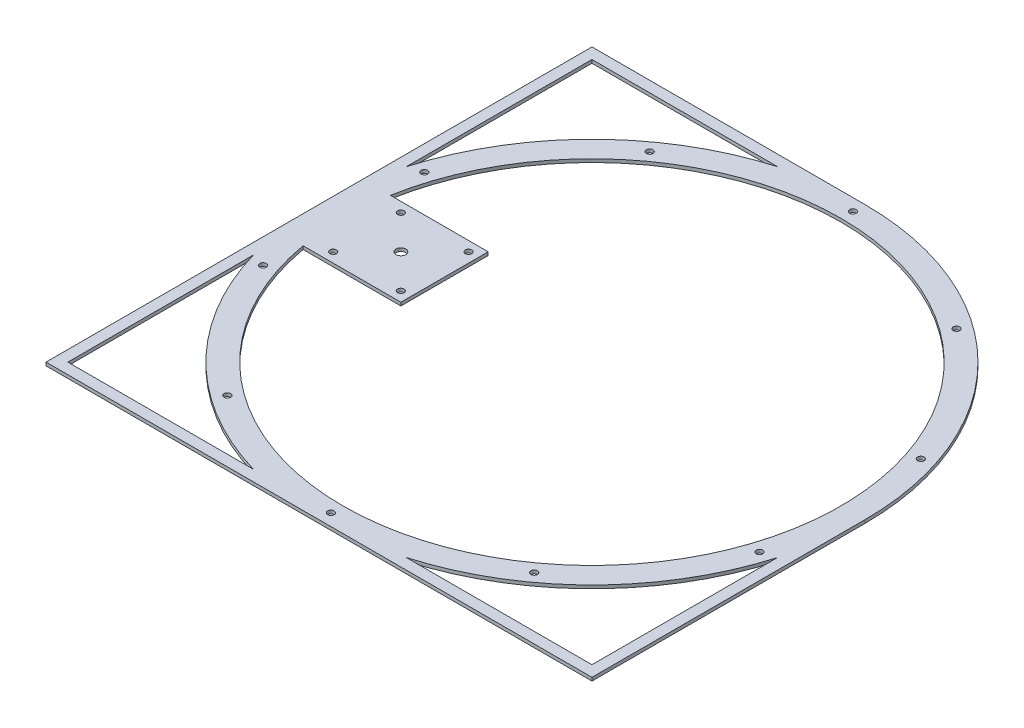
ISO-10303-21;
HEADER;
FILE_DESCRIPTION(('STEP AP214'),'2;1');
FILE_NAME('part.step','',(''),(''),'','','');
FILE_SCHEMA(('AUTOMOTIVE_DESIGN { 1 0 10303 214 1 1 1 1 }'));
ENDSEC;
DATA;
#1=APPLICATION_CONTEXT('core data for automotive mechanical design processes');
#2=APPLICATION_PROTOCOL_DEFINITION('international standard','automotive_design',2000,#1);
#3=PRODUCT_CONTEXT('',#1,'mechanical');
#4=PRODUCT('Part','Part','',(#3));
#5=PRODUCT_RELATED_PRODUCT_CATEGORY('part','',(#4));
#6=PRODUCT_DEFINITION_FORMATION('','',#4);
#7=PRODUCT_DEFINITION_CONTEXT('part definition',#1,'design');
#8=PRODUCT_DEFINITION('design','',#6,#7);
#9=PRODUCT_DEFINITION_SHAPE('','',#8);
#10=(LENGTH_UNIT() NAMED_UNIT(*) SI_UNIT(.MILLI.,.METRE.));
#11=(NAMED_UNIT(*) PLANE_ANGLE_UNIT() SI_UNIT($,.RADIAN.));
#12=(NAMED_UNIT(*) SI_UNIT($,.STERADIAN.) SOLID_ANGLE_UNIT());
#13=UNCERTAINTY_MEASURE_WITH_UNIT(LENGTH_MEASURE(1.E-05),#10,'distance_accuracy_value','');
#14=(GEOMETRIC_REPRESENTATION_CONTEXT(3) GLOBAL_UNCERTAINTY_ASSIGNED_CONTEXT((#13)) GLOBAL_UNIT_ASSIGNED_CONTEXT((#10,
#11,#12)) REPRESENTATION_CONTEXT('',''));
#15=CARTESIAN_POINT('',(0.,0.,0.));
#16=DIRECTION('',(0.,0.,1.));
#17=DIRECTION('',(1.,0.,0.));
#18=AXIS2_PLACEMENT_3D('',#15,#16,#17);
#19=CARTESIAN_POINT('',(0.,1.5,0.));
#20=DIRECTION('',(0.,1.,0.));
#21=DIRECTION('',(0.,0.,1.));
#22=AXIS2_PLACEMENT_3D('',#19,#20,#21);
#23=PLANE('',#22);
#24=CARTESIAN_POINT('',(-125.,1.5,125.));
#25=DIRECTION('',(0.,1.,0.));
#26=DIRECTION('',(0.,0.,1.));
#27=AXIS2_PLACEMENT_3D('',#24,#25,#26);
#28=CIRCLE('',#27,125.);
#29=CARTESIAN_POINT('',(0.,1.5,125.));
#30=VERTEX_POINT('',#29);
#31=CARTESIAN_POINT('',(-125.,1.5,0.));
#32=VERTEX_POINT('',#31);
#33=EDGE_CURVE('E254',#30,#32,#28,.T.);
#34=ORIENTED_EDGE('',*,*,#33,.T.);
#35=DIRECTION('',(-1.,0.,0.));
#36=VECTOR('',#35,1.);
#37=CARTESIAN_POINT('',(0.,1.5,0.));
#38=LINE('',#37,#36);
#39=CARTESIAN_POINT('',(-250.,1.5,0.));
#40=VERTEX_POINT('',#39);
#41=EDGE_CURVE('E258',#32,#40,#38,.T.);
#42=ORIENTED_EDGE('',*,*,#41,.T.);
#43=DIRECTION('',(0.,0.,1.));
#44=VECTOR('',#43,1.);
#45=CARTESIAN_POINT('',(-250.,1.5,0.));
#46=LINE('',#45,#44);
#47=CARTESIAN_POINT('',(-250.,1.5,250.));
#48=VERTEX_POINT('',#47);
#49=EDGE_CURVE('E383',#40,#48,#46,.T.);
#50=ORIENTED_EDGE('',*,*,#49,.T.);
#51=DIRECTION('',(-1.,0.,0.));
#52=VECTOR('',#51,1.);
#53=CARTESIAN_POINT('',(0.,1.5,250.));
#54=LINE('',#53,#52);
#55=CARTESIAN_POINT('',(0.,1.5,250.));
#56=VERTEX_POINT('',#55);
#57=EDGE_CURVE('E289',#56,#48,#54,.T.);
#58=ORIENTED_EDGE('',*,*,#57,.F.);
#59=DIRECTION('',(0.,0.,1.));
#60=VECTOR('',#59,1.);
#61=CARTESIAN_POINT('',(0.,1.5,0.));
#62=LINE('',#61,#60);
#63=EDGE_CURVE('E261',#30,#56,#62,.T.);
#64=ORIENTED_EDGE('',*,*,#63,.F.);
#65=EDGE_LOOP('',(#34,#42,#50,#58,#64));
#66=FACE_BOUND('',#65,.T.);
#67=CARTESIAN_POINT('',(-125.,1.5,125.));
#68=DIRECTION('',(0.,1.,0.));
#69=DIRECTION('',(0.,0.,1.));
#70=AXIS2_PLACEMENT_3D('',#67,#68,#69);
#71=CIRCLE('',#70,114.05);
#72=CARTESIAN_POINT('',(-237.2826901174,1.5,145.));
#73=VERTEX_POINT('',#72);
#74=CARTESIAN_POINT('',(-237.2826901174,1.5,105.));
#75=VERTEX_POINT('',#74);
#76=EDGE_CURVE('E552',#73,#75,#71,.T.);
#77=ORIENTED_EDGE('',*,*,#76,.F.);
#78=DIRECTION('',(1.,0.,0.));
#79=VECTOR('',#78,1.);
#80=CARTESIAN_POINT('',(-1.00613961606655E-13,1.5,145.));
#81=LINE('',#80,#79);
#82=CARTESIAN_POINT('',(-192.5,1.5,145.));
#83=VERTEX_POINT('',#82);
#84=EDGE_CURVE('E565',#73,#83,#81,.T.);
#85=ORIENTED_EDGE('',*,*,#84,.T.);
#86=DIRECTION('',(0.,0.,-1.));
#87=VECTOR('',#86,1.);
#88=CARTESIAN_POINT('',(-192.5,1.5,0.));
#89=LINE('',#88,#87);
#90=CARTESIAN_POINT('',(-192.5,1.5,105.));
#91=VERTEX_POINT('',#90);
#92=EDGE_CURVE('E561',#83,#91,#89,.T.);
#93=ORIENTED_EDGE('',*,*,#92,.T.);
#94=DIRECTION('',(-1.,0.,0.));
#95=VECTOR('',#94,1.);
#96=CARTESIAN_POINT('',(0.,1.5,105.));
#97=LINE('',#96,#95);
#98=EDGE_CURVE('E555',#91,#75,#97,.T.);
#99=ORIENTED_EDGE('',*,*,#98,.T.);
#100=EDGE_LOOP('',(#77,#85,#93,#99));
#101=FACE_BOUND('',#100,.T.);
#102=CARTESIAN_POINT('',(-197.,1.5,140.5));
#103=DIRECTION('',(0.,1.,0.));
#104=DIRECTION('',(0.,0.,1.));
#105=AXIS2_PLACEMENT_3D('',#102,#103,#104);
#106=CIRCLE('',#105,1.5);
#107=CARTESIAN_POINT('',(-197.,1.5,142.));
#108=VERTEX_POINT('',#107);
#109=EDGE_CURVE('E512',#108,#108,#106,.T.);
#110=ORIENTED_EDGE('',*,*,#109,.F.);
#111=EDGE_LOOP('',(#110));
#112=FACE_BOUND('',#111,.T.);
#113=CARTESIAN_POINT('',(-197.,1.5,109.5));
#114=DIRECTION('',(0.,1.,0.));
#115=DIRECTION('',(0.,0.,1.));
#116=AXIS2_PLACEMENT_3D('',#113,#114,#115);
#117=CIRCLE('',#116,1.5);
#118=CARTESIAN_POINT('',(-197.,1.5,111.));
#119=VERTEX_POINT('',#118);
#120=EDGE_CURVE('E527',#119,#119,#117,.T.);
#121=ORIENTED_EDGE('',*,*,#120,.F.);
#122=EDGE_LOOP('',(#121));
#123=FACE_BOUND('',#122,.T.);
#124=CARTESIAN_POINT('',(-228.,1.5,109.5));
#125=DIRECTION('',(0.,1.,0.));
#126=DIRECTION('',(0.,0.,1.));
#127=AXIS2_PLACEMENT_3D('',#124,#125,#126);
#128=CIRCLE('',#127,1.50000000000003);
#129=CARTESIAN_POINT('',(-228.,1.5,111.));
#130=VERTEX_POINT('',#129);
#131=EDGE_CURVE('E523',#130,#130,#128,.T.);
#132=ORIENTED_EDGE('',*,*,#131,.F.);
#133=EDGE_LOOP('',(#132));
#134=FACE_BOUND('',#133,.T.);
#135=CARTESIAN_POINT('',(-228.,1.5,140.5));
#136=DIRECTION('',(0.,1.,0.));
#137=DIRECTION('',(0.,0.,1.));
#138=AXIS2_PLACEMENT_3D('',#135,#136,#137);
#139=CIRCLE('',#138,1.49999999999997);
#140=CARTESIAN_POINT('',(-228.,1.5,142.));
#141=VERTEX_POINT('',#140);
#142=EDGE_CURVE('E519',#141,#141,#139,.T.);
#143=ORIENTED_EDGE('',*,*,#142,.F.);
#144=EDGE_LOOP('',(#143));
#145=FACE_BOUND('',#144,.T.);
#146=CARTESIAN_POINT('',(-212.5,1.5,125.));
#147=DIRECTION('',(0.,1.,0.));
#148=DIRECTION('',(0.,0.,1.));
#149=AXIS2_PLACEMENT_3D('',#146,#147,#148);
#150=CIRCLE('',#149,2.25000000000001);
#151=CARTESIAN_POINT('',(-212.5,1.5,127.25));
#152=VERTEX_POINT('',#151);
#153=EDGE_CURVE('E399',#152,#152,#150,.T.);
#154=ORIENTED_EDGE('',*,*,#153,.F.);
#155=EDGE_LOOP('',(#154));
#156=FACE_BOUND('',#155,.T.);
#157=CARTESIAN_POINT('',(-125.,1.5,5.475));
#158=DIRECTION('',(0.,1.,0.));
#159=DIRECTION('',(0.,0.,1.));
#160=AXIS2_PLACEMENT_3D('',#157,#158,#159);
#161=CIRCLE('',#160,1.5);
#162=CARTESIAN_POINT('',(-125.,1.5,6.975));
#163=VERTEX_POINT('',#162);
#164=EDGE_CURVE('E282',#163,#163,#161,.T.);
#165=ORIENTED_EDGE('',*,*,#164,.F.);
#166=EDGE_LOOP('',(#165));
#167=FACE_BOUND('',#166,.T.);
#168=CARTESIAN_POINT('',(-195.255032280254,1.5,28.3022437473405));
#169=DIRECTION('',(0.,1.,0.));
#170=DIRECTION('',(0.,0.,1.));
#171=AXIS2_PLACEMENT_3D('',#168,#169,#170);
#172=CIRCLE('',#171,1.5);
#173=CARTESIAN_POINT('',(-195.255032280254,1.5,29.8022437473405));
#174=VERTEX_POINT('',#173);
#175=EDGE_CURVE('E287',#174,#174,#172,.T.);
#176=ORIENTED_EDGE('',*,*,#175,.F.);
#177=EDGE_LOOP('',(#176));
#178=FACE_BOUND('',#177,.T.);
#179=CARTESIAN_POINT('',(-238.675030110163,1.5,161.935256252676));
#180=DIRECTION('',(0.,1.,0.));
#181=DIRECTION('',(0.,0.,1.));
#182=AXIS2_PLACEMENT_3D('',#179,#180,#181);
#183=CIRCLE('',#182,1.49999999999998);
#184=CARTESIAN_POINT('',(-238.675030110163,1.5,163.435256252676));
#185=VERTEX_POINT('',#184);
#186=EDGE_CURVE('E296',#185,#185,#183,.T.);
#187=ORIENTED_EDGE('',*,*,#186,.F.);
#188=EDGE_LOOP('',(#187));
#189=FACE_BOUND('',#188,.T.);
#190=CARTESIAN_POINT('',(-124.999999999977,1.5,244.525));
#191=DIRECTION('',(0.,1.,0.));
#192=DIRECTION('',(0.,0.,1.));
#193=AXIS2_PLACEMENT_3D('',#190,#191,#192);
#194=CIRCLE('',#193,1.49999999999996);
#195=CARTESIAN_POINT('',(-124.999999999977,1.5,246.025));
#196=VERTEX_POINT('',#195);
#197=EDGE_CURVE('E300',#196,#196,#194,.T.);
#198=ORIENTED_EDGE('',*,*,#197,.F.);
#199=EDGE_LOOP('',(#198));
#200=FACE_BOUND('',#199,.T.);
#201=CARTESIAN_POINT('',(-11.3249698898063,1.5,161.935256252655));
#202=DIRECTION('',(0.,1.,0.));
#203=DIRECTION('',(0.,0.,1.));
#204=AXIS2_PLACEMENT_3D('',#201,#202,#203);
#205=CIRCLE('',#204,1.5);
#206=CARTESIAN_POINT('',(-11.3249698898063,1.5,163.435256252655));
#207=VERTEX_POINT('',#206);
#208=EDGE_CURVE('E304',#207,#207,#205,.T.);
#209=ORIENTED_EDGE('',*,*,#208,.F.);
#210=EDGE_LOOP('',(#209));
#211=FACE_BOUND('',#210,.T.);
#212=CARTESIAN_POINT('',(-54.7449677197397,1.5,28.3022437473275));
#213=DIRECTION('',(0.,1.,0.));
#214=DIRECTION('',(0.,0.,1.));
#215=AXIS2_PLACEMENT_3D('',#212,#213,#214);
#216=CIRCLE('',#215,1.50000000000001);
#217=CARTESIAN_POINT('',(-54.7449677197397,1.5,29.8022437473275));
#218=VERTEX_POINT('',#217);
#219=EDGE_CURVE('E308',#218,#218,#216,.T.);
#220=ORIENTED_EDGE('',*,*,#219,.F.);
#221=EDGE_LOOP('',(#220));
#222=FACE_BOUND('',#221,.T.);
#223=CARTESIAN_POINT('',(-238.675030110175,1.5,88.0647437473363));
#224=DIRECTION('',(0.,1.,0.));
#225=DIRECTION('',(0.,0.,1.));
#226=AXIS2_PLACEMENT_3D('',#223,#224,#225);
#227=CIRCLE('',#226,1.49999999999999);
#228=CARTESIAN_POINT('',(-238.675030110175,1.5,89.5647437473363));
#229=VERTEX_POINT('',#228);
#230=EDGE_CURVE('E312',#229,#229,#227,.T.);
#231=ORIENTED_EDGE('',*,*,#230,.F.);
#232=EDGE_LOOP('',(#231));
#233=FACE_BOUND('',#232,.T.);
#234=CARTESIAN_POINT('',(-195.255032280253,1.5,221.697756252667));
#235=DIRECTION('',(0.,1.,0.));
#236=DIRECTION('',(0.,0.,1.));
#237=AXIS2_PLACEMENT_3D('',#234,#235,#236);
#238=CIRCLE('',#237,1.50000000000002);
#239=CARTESIAN_POINT('',(-195.255032280253,1.5,223.197756252667));
#240=VERTEX_POINT('',#239);
#241=EDGE_CURVE('E316',#240,#240,#238,.T.);
#242=ORIENTED_EDGE('',*,*,#241,.F.);
#243=EDGE_LOOP('',(#242));
#244=FACE_BOUND('',#243,.T.);
#245=CARTESIAN_POINT('',(-54.7449677197365,1.5,221.697756252664));
#246=DIRECTION('',(0.,1.,0.));
#247=DIRECTION('',(0.,0.,1.));
#248=AXIS2_PLACEMENT_3D('',#245,#246,#247);
#249=CIRCLE('',#248,1.5);
#250=CARTESIAN_POINT('',(-54.7449677197365,1.5,223.197756252664));
#251=VERTEX_POINT('',#250);
#252=EDGE_CURVE('E320',#251,#251,#249,.T.);
#253=ORIENTED_EDGE('',*,*,#252,.F.);
#254=EDGE_LOOP('',(#253));
#255=FACE_BOUND('',#254,.T.);
#256=CARTESIAN_POINT('',(-11.3249698898193,1.5,88.0647437473315));
#257=DIRECTION('',(0.,1.,0.));
#258=DIRECTION('',(0.,0.,1.));
#259=AXIS2_PLACEMENT_3D('',#256,#257,#258);
#260=CIRCLE('',#259,1.50000000000001);
#261=CARTESIAN_POINT('',(-11.3249698898193,1.5,89.5647437473315));
#262=VERTEX_POINT('',#261);
#263=EDGE_CURVE('E324',#262,#262,#260,.T.);
#264=ORIENTED_EDGE('',*,*,#263,.F.);
#265=EDGE_LOOP('',(#264));
#266=FACE_BOUND('',#265,.T.);
#267=DIRECTION('',(1.,0.,0.));
#268=VECTOR('',#267,1.);
#269=CARTESIAN_POINT('',(0.,1.5,4.99999999999777));
#270=LINE('',#269,#268);
#271=CARTESIAN_POINT('',(-245.,1.5,5.));
#272=VERTEX_POINT('',#271);
#273=CARTESIAN_POINT('',(-159.999999999997,1.5,4.99999999999923));
#274=VERTEX_POINT('',#273);
#275=EDGE_CURVE('E473',#272,#274,#270,.T.);
#276=ORIENTED_EDGE('',*,*,#275,.T.);
#277=CARTESIAN_POINT('',(-125.,1.5,125.));
#278=DIRECTION('',(0.,1.,0.));
#279=DIRECTION('',(0.,0.,1.));
#280=AXIS2_PLACEMENT_3D('',#277,#278,#279);
#281=CIRCLE('',#280,125.);
#282=CARTESIAN_POINT('',(-245.000000000001,1.5,90.0000000000029));
#283=VERTEX_POINT('',#282);
#284=EDGE_CURVE('E468',#274,#283,#281,.T.);
#285=ORIENTED_EDGE('',*,*,#284,.T.);
#286=DIRECTION('',(0.,0.,1.));
#287=VECTOR('',#286,1.);
#288=CARTESIAN_POINT('',(-245.,1.5,-2.16003685526328E-12));
#289=LINE('',#288,#287);
#290=EDGE_CURVE('E504',#272,#283,#289,.T.);
#291=ORIENTED_EDGE('',*,*,#290,.F.);
#292=EDGE_LOOP('',(#276,#285,#291));
#293=FACE_BOUND('',#292,.T.);
#294=DIRECTION('',(-1.,0.,0.));
#295=VECTOR('',#294,1.);
#296=CARTESIAN_POINT('',(1.60002730019502E-13,1.5,245.000000000001));
#297=LINE('',#296,#295);
#298=CARTESIAN_POINT('',(-4.9999999999992,1.5,245.000000000001));
#299=VERTEX_POINT('',#298);
#300=CARTESIAN_POINT('',(-90.0000000000027,1.5,245.000000000001));
#301=VERTEX_POINT('',#300);
#302=EDGE_CURVE('E484',#299,#301,#297,.T.);
#303=ORIENTED_EDGE('',*,*,#302,.T.);
#304=CARTESIAN_POINT('',(-125.,1.5,125.));
#305=DIRECTION('',(0.,1.,0.));
#306=DIRECTION('',(0.,0.,1.));
#307=AXIS2_PLACEMENT_3D('',#304,#305,#306);
#308=CIRCLE('',#307,125.);
#309=CARTESIAN_POINT('',(-4.99999999999914,1.5,159.999999999997));
#310=VERTEX_POINT('',#309);
#311=EDGE_CURVE('E152',#301,#310,#308,.T.);
#312=ORIENTED_EDGE('',*,*,#311,.T.);
#313=DIRECTION('',(0.,0.,-1.));
#314=VECTOR('',#313,1.);
#315=CARTESIAN_POINT('',(-4.99999999999904,1.5,0.));
#316=LINE('',#315,#314);
#317=EDGE_CURVE('E488',#299,#310,#316,.T.);
#318=ORIENTED_EDGE('',*,*,#317,.F.);
#319=EDGE_LOOP('',(#303,#312,#318));
#320=FACE_BOUND('',#319,.T.);
#321=DIRECTION('',(0.,0.,-1.));
#322=VECTOR('',#321,1.);
#323=CARTESIAN_POINT('',(-244.999999999993,1.5,-7.44012694590663E-12));
#324=LINE('',#323,#322);
#325=CARTESIAN_POINT('',(-245.000000000001,1.5,245.000000000001));
#326=VERTEX_POINT('',#325);
#327=CARTESIAN_POINT('',(-244.999999999998,1.5,159.999999999998));
#328=VERTEX_POINT('',#327);
#329=EDGE_CURVE('E582',#326,#328,#324,.T.);
#330=ORIENTED_EDGE('',*,*,#329,.T.);
#331=CARTESIAN_POINT('',(-125.,1.5,125.));
#332=DIRECTION('',(0.,1.,0.));
#333=DIRECTION('',(0.,0.,1.));
#334=AXIS2_PLACEMENT_3D('',#331,#332,#333);
#335=CIRCLE('',#334,125.);
#336=CARTESIAN_POINT('',(-159.999999999997,1.5,245.000000000001));
#337=VERTEX_POINT('',#336);
#338=EDGE_CURVE('E144',#328,#337,#335,.T.);
#339=ORIENTED_EDGE('',*,*,#338,.T.);
#340=DIRECTION('',(1.,0.,0.));
#341=VECTOR('',#340,1.);
#342=CARTESIAN_POINT('',(0.,1.5,245.000000000001));
#343=LINE('',#342,#341);
#344=EDGE_CURVE('E466',#326,#337,#343,.T.);
#345=ORIENTED_EDGE('',*,*,#344,.F.);
#346=EDGE_LOOP('',(#330,#339,#345));
#347=FACE_BOUND('',#346,.T.);
#348=ADVANCED_FACE('F128',(#66,#101,#112,#123,#134,#145,#156,#167,#178,#189,#200,#211,#222,#233,
#244,#255,#266,#293,#320,#347),#23,.T.);
#349=CARTESIAN_POINT('',(0.,0.,0.));
#350=DIRECTION('',(0.,1.,0.));
#351=DIRECTION('',(0.,0.,1.));
#352=AXIS2_PLACEMENT_3D('',#349,#350,#351);
#353=PLANE('',#352);
#354=CARTESIAN_POINT('',(-125.,0.,125.));
#355=DIRECTION('',(0.,1.,0.));
#356=DIRECTION('',(0.,0.,1.));
#357=AXIS2_PLACEMENT_3D('',#354,#355,#356);
#358=CIRCLE('',#357,125.);
#359=CARTESIAN_POINT('',(-90.0000000000027,0.,245.000000000001));
#360=VERTEX_POINT('',#359);
#361=CARTESIAN_POINT('',(-4.99999999999914,0.,159.999999999997));
#362=VERTEX_POINT('',#361);
#363=EDGE_CURVE('E446',#360,#362,#358,.T.);
#364=ORIENTED_EDGE('',*,*,#363,.F.);
#365=DIRECTION('',(-1.,0.,0.));
#366=VECTOR('',#365,1.);
#367=CARTESIAN_POINT('',(1.60002730019502E-13,0.,245.000000000001));
#368=LINE('',#367,#366);
#369=CARTESIAN_POINT('',(-4.9999999999992,0.,245.000000000001));
#370=VERTEX_POINT('',#369);
#371=EDGE_CURVE('E439',#370,#360,#368,.T.);
#372=ORIENTED_EDGE('',*,*,#371,.F.);
#373=DIRECTION('',(0.,0.,-1.));
#374=VECTOR('',#373,1.);
#375=CARTESIAN_POINT('',(-4.99999999999904,0.,0.));
#376=LINE('',#375,#374);
#377=EDGE_CURVE('E442',#370,#362,#376,.T.);
#378=ORIENTED_EDGE('',*,*,#377,.T.);
#379=EDGE_LOOP('',(#364,#372,#378));
#380=FACE_BOUND('',#379,.T.);
#381=DIRECTION('',(1.,0.,0.));
#382=VECTOR('',#381,1.);
#383=CARTESIAN_POINT('',(-1.00613961606655E-13,0.,145.));
#384=LINE('',#383,#382);
#385=CARTESIAN_POINT('',(-237.2826901174,0.,145.));
#386=VERTEX_POINT('',#385);
#387=CARTESIAN_POINT('',(-192.5,0.,145.));
#388=VERTEX_POINT('',#387);
#389=EDGE_CURVE('E432',#386,#388,#384,.T.);
#390=ORIENTED_EDGE('',*,*,#389,.F.);
#391=CARTESIAN_POINT('',(-125.,0.,125.));
#392=DIRECTION('',(0.,1.,0.));
#393=DIRECTION('',(0.,0.,1.));
#394=AXIS2_PLACEMENT_3D('',#391,#392,#393);
#395=CIRCLE('',#394,114.05);
#396=CARTESIAN_POINT('',(-237.2826901174,0.,105.));
#397=VERTEX_POINT('',#396);
#398=EDGE_CURVE('E435',#386,#397,#395,.T.);
#399=ORIENTED_EDGE('',*,*,#398,.T.);
#400=DIRECTION('',(-1.,0.,0.));
#401=VECTOR('',#400,1.);
#402=CARTESIAN_POINT('',(0.,0.,105.));
#403=LINE('',#402,#401);
#404=CARTESIAN_POINT('',(-192.5,0.,105.));
#405=VERTEX_POINT('',#404);
#406=EDGE_CURVE('E425',#405,#397,#403,.T.);
#407=ORIENTED_EDGE('',*,*,#406,.F.);
#408=DIRECTION('',(0.,0.,-1.));
#409=VECTOR('',#408,1.);
#410=CARTESIAN_POINT('',(-192.5,0.,0.));
#411=LINE('',#410,#409);
#412=EDGE_CURVE('E428',#388,#405,#411,.T.);
#413=ORIENTED_EDGE('',*,*,#412,.F.);
#414=EDGE_LOOP('',(#390,#399,#407,#413));
#415=FACE_BOUND('',#414,.T.);
#416=CARTESIAN_POINT('',(-125.,0.,125.));
#417=DIRECTION('',(0.,1.,0.));
#418=DIRECTION('',(0.,0.,1.));
#419=AXIS2_PLACEMENT_3D('',#416,#417,#418);
#420=CIRCLE('',#419,125.);
#421=CARTESIAN_POINT('',(-159.999999999997,0.,4.99999999999923));
#422=VERTEX_POINT('',#421);
#423=CARTESIAN_POINT('',(-245.000000000001,0.,90.0000000000029));
#424=VERTEX_POINT('',#423);
#425=EDGE_CURVE('E420',#422,#424,#420,.T.);
#426=ORIENTED_EDGE('',*,*,#425,.F.);
#427=DIRECTION('',(1.,0.,0.));
#428=VECTOR('',#427,1.);
#429=CARTESIAN_POINT('',(0.,0.,4.99999999999777));
#430=LINE('',#429,#428);
#431=CARTESIAN_POINT('',(-245.,0.,5.));
#432=VERTEX_POINT('',#431);
#433=EDGE_CURVE('E393',#432,#422,#430,.T.);
#434=ORIENTED_EDGE('',*,*,#433,.F.);
#435=DIRECTION('',(0.,0.,1.));
#436=VECTOR('',#435,1.);
#437=CARTESIAN_POINT('',(-245.,0.,-2.16003685526328E-12));
#438=LINE('',#437,#436);
#439=EDGE_CURVE('E416',#432,#424,#438,.T.);
#440=ORIENTED_EDGE('',*,*,#439,.T.);
#441=EDGE_LOOP('',(#426,#434,#440));
#442=FACE_BOUND('',#441,.T.);
#443=CARTESIAN_POINT('',(-197.,0.,140.5));
#444=DIRECTION('',(0.,1.,0.));
#445=DIRECTION('',(0.,0.,1.));
#446=AXIS2_PLACEMENT_3D('',#443,#444,#445);
#447=CIRCLE('',#446,1.5);
#448=CARTESIAN_POINT('',(-197.,0.,142.));
#449=VERTEX_POINT('',#448);
#450=EDGE_CURVE('E333',#449,#449,#447,.T.);
#451=ORIENTED_EDGE('',*,*,#450,.T.);
#452=EDGE_LOOP('',(#451));
#453=FACE_BOUND('',#452,.T.);
#454=CARTESIAN_POINT('',(-197.,0.,109.5));
#455=DIRECTION('',(0.,1.,0.));
#456=DIRECTION('',(0.,0.,1.));
#457=AXIS2_PLACEMENT_3D('',#454,#455,#456);
#458=CIRCLE('',#457,1.5);
#459=CARTESIAN_POINT('',(-197.,0.,111.));
#460=VERTEX_POINT('',#459);
#461=EDGE_CURVE('E407',#460,#460,#458,.T.);
#462=ORIENTED_EDGE('',*,*,#461,.T.);
#463=EDGE_LOOP('',(#462));
#464=FACE_BOUND('',#463,.T.);
#465=CARTESIAN_POINT('',(-228.,0.,109.5));
#466=DIRECTION('',(0.,1.,0.));
#467=DIRECTION('',(0.,0.,1.));
#468=AXIS2_PLACEMENT_3D('',#465,#466,#467);
#469=CIRCLE('',#468,1.50000000000003);
#470=CARTESIAN_POINT('',(-228.,0.,111.));
#471=VERTEX_POINT('',#470);
#472=EDGE_CURVE('E403',#471,#471,#469,.T.);
#473=ORIENTED_EDGE('',*,*,#472,.T.);
#474=EDGE_LOOP('',(#473));
#475=FACE_BOUND('',#474,.T.);
#476=CARTESIAN_POINT('',(-228.,0.,140.5));
#477=DIRECTION('',(0.,1.,0.));
#478=DIRECTION('',(0.,0.,1.));
#479=AXIS2_PLACEMENT_3D('',#476,#477,#478);
#480=CIRCLE('',#479,1.49999999999997);
#481=CARTESIAN_POINT('',(-228.,0.,142.));
#482=VERTEX_POINT('',#481);
#483=EDGE_CURVE('E398',#482,#482,#480,.T.);
#484=ORIENTED_EDGE('',*,*,#483,.T.);
#485=EDGE_LOOP('',(#484));
#486=FACE_BOUND('',#485,.T.);
#487=CARTESIAN_POINT('',(-212.5,0.,125.));
#488=DIRECTION('',(0.,1.,0.));
#489=DIRECTION('',(0.,0.,1.));
#490=AXIS2_PLACEMENT_3D('',#487,#488,#489);
#491=CIRCLE('',#490,2.25000000000001);
#492=CARTESIAN_POINT('',(-212.5,0.,127.25));
#493=VERTEX_POINT('',#492);
#494=EDGE_CURVE('E394',#493,#493,#491,.T.);
#495=ORIENTED_EDGE('',*,*,#494,.T.);
#496=EDGE_LOOP('',(#495));
#497=FACE_BOUND('',#496,.T.);
#498=CARTESIAN_POINT('',(-125.,0.,5.475));
#499=DIRECTION('',(0.,1.,0.));
#500=DIRECTION('',(0.,0.,1.));
#501=AXIS2_PLACEMENT_3D('',#498,#499,#500);
#502=CIRCLE('',#501,1.5);
#503=CARTESIAN_POINT('',(-125.,0.,6.975));
#504=VERTEX_POINT('',#503);
#505=EDGE_CURVE('E343',#504,#504,#502,.T.);
#506=ORIENTED_EDGE('',*,*,#505,.T.);
#507=EDGE_LOOP('',(#506));
#508=FACE_BOUND('',#507,.T.);
#509=CARTESIAN_POINT('',(-195.255032280254,0.,28.3022437473405));
#510=DIRECTION('',(0.,1.,0.));
#511=DIRECTION('',(0.,0.,1.));
#512=AXIS2_PLACEMENT_3D('',#509,#510,#511);
#513=CIRCLE('',#512,1.5);
#514=CARTESIAN_POINT('',(-195.255032280254,0.,29.8022437473405));
#515=VERTEX_POINT('',#514);
#516=EDGE_CURVE('E347',#515,#515,#513,.T.);
#517=ORIENTED_EDGE('',*,*,#516,.T.);
#518=EDGE_LOOP('',(#517));
#519=FACE_BOUND('',#518,.T.);
#520=CARTESIAN_POINT('',(-238.675030110163,0.,161.935256252676));
#521=DIRECTION('',(0.,1.,0.));
#522=DIRECTION('',(0.,0.,1.));
#523=AXIS2_PLACEMENT_3D('',#520,#521,#522);
#524=CIRCLE('',#523,1.49999999999998);
#525=CARTESIAN_POINT('',(-238.675030110163,0.,163.435256252676));
#526=VERTEX_POINT('',#525);
#527=EDGE_CURVE('E351',#526,#526,#524,.T.);
#528=ORIENTED_EDGE('',*,*,#527,.T.);
#529=EDGE_LOOP('',(#528));
#530=FACE_BOUND('',#529,.T.);
#531=CARTESIAN_POINT('',(-124.999999999977,0.,244.525));
#532=DIRECTION('',(0.,1.,0.));
#533=DIRECTION('',(0.,0.,1.));
#534=AXIS2_PLACEMENT_3D('',#531,#532,#533);
#535=CIRCLE('',#534,1.49999999999996);
#536=CARTESIAN_POINT('',(-124.999999999977,0.,246.025));
#537=VERTEX_POINT('',#536);
#538=EDGE_CURVE('E355',#537,#537,#535,.T.);
#539=ORIENTED_EDGE('',*,*,#538,.T.);
#540=EDGE_LOOP('',(#539));
#541=FACE_BOUND('',#540,.T.);
#542=CARTESIAN_POINT('',(-11.3249698898063,0.,161.935256252655));
#543=DIRECTION('',(0.,1.,0.));
#544=DIRECTION('',(0.,0.,1.));
#545=AXIS2_PLACEMENT_3D('',#542,#543,#544);
#546=CIRCLE('',#545,1.5);
#547=CARTESIAN_POINT('',(-11.3249698898063,0.,163.435256252655));
#548=VERTEX_POINT('',#547);
#549=EDGE_CURVE('E359',#548,#548,#546,.T.);
#550=ORIENTED_EDGE('',*,*,#549,.T.);
#551=EDGE_LOOP('',(#550));
#552=FACE_BOUND('',#551,.T.);
#553=CARTESIAN_POINT('',(-54.7449677197397,0.,28.3022437473275));
#554=DIRECTION('',(0.,1.,0.));
#555=DIRECTION('',(0.,0.,1.));
#556=AXIS2_PLACEMENT_3D('',#553,#554,#555);
#557=CIRCLE('',#556,1.50000000000001);
#558=CARTESIAN_POINT('',(-54.7449677197397,0.,29.8022437473275));
#559=VERTEX_POINT('',#558);
#560=EDGE_CURVE('E363',#559,#559,#557,.T.);
#561=ORIENTED_EDGE('',*,*,#560,.T.);
#562=EDGE_LOOP('',(#561));
#563=FACE_BOUND('',#562,.T.);
#564=CARTESIAN_POINT('',(-238.675030110175,0.,88.0647437473363));
#565=DIRECTION('',(0.,1.,0.));
#566=DIRECTION('',(0.,0.,1.));
#567=AXIS2_PLACEMENT_3D('',#564,#565,#566);
#568=CIRCLE('',#567,1.49999999999999);
#569=CARTESIAN_POINT('',(-238.675030110175,0.,89.5647437473363));
#570=VERTEX_POINT('',#569);
#571=EDGE_CURVE('E367',#570,#570,#568,.T.);
#572=ORIENTED_EDGE('',*,*,#571,.T.);
#573=EDGE_LOOP('',(#572));
#574=FACE_BOUND('',#573,.T.);
#575=CARTESIAN_POINT('',(-195.255032280253,0.,221.697756252667));
#576=DIRECTION('',(0.,1.,0.));
#577=DIRECTION('',(0.,0.,1.));
#578=AXIS2_PLACEMENT_3D('',#575,#576,#577);
#579=CIRCLE('',#578,1.50000000000002);
#580=CARTESIAN_POINT('',(-195.255032280253,0.,223.197756252667));
#581=VERTEX_POINT('',#580);
#582=EDGE_CURVE('E371',#581,#581,#579,.T.);
#583=ORIENTED_EDGE('',*,*,#582,.T.);
#584=EDGE_LOOP('',(#583));
#585=FACE_BOUND('',#584,.T.);
#586=CARTESIAN_POINT('',(-54.7449677197365,0.,221.697756252664));
#587=DIRECTION('',(0.,1.,0.));
#588=DIRECTION('',(0.,0.,1.));
#589=AXIS2_PLACEMENT_3D('',#586,#587,#588);
#590=CIRCLE('',#589,1.5);
#591=CARTESIAN_POINT('',(-54.7449677197365,0.,223.197756252664));
#592=VERTEX_POINT('',#591);
#593=EDGE_CURVE('E375',#592,#592,#590,.T.);
#594=ORIENTED_EDGE('',*,*,#593,.T.);
#595=EDGE_LOOP('',(#594));
#596=FACE_BOUND('',#595,.T.);
#597=CARTESIAN_POINT('',(-11.3249698898193,0.,88.0647437473315));
#598=DIRECTION('',(0.,1.,0.));
#599=DIRECTION('',(0.,0.,1.));
#600=AXIS2_PLACEMENT_3D('',#597,#598,#599);
#601=CIRCLE('',#600,1.50000000000001);
#602=CARTESIAN_POINT('',(-11.3249698898193,0.,89.5647437473315));
#603=VERTEX_POINT('',#602);
#604=EDGE_CURVE('E379',#603,#603,#601,.T.);
#605=ORIENTED_EDGE('',*,*,#604,.T.);
#606=EDGE_LOOP('',(#605));
#607=FACE_BOUND('',#606,.T.);
#608=DIRECTION('',(-1.,0.,0.));
#609=VECTOR('',#608,1.);
#610=CARTESIAN_POINT('',(0.,0.,0.));
#611=LINE('',#610,#609);
#612=CARTESIAN_POINT('',(-125.,0.,0.));
#613=VERTEX_POINT('',#612);
#614=CARTESIAN_POINT('',(-250.,0.,0.));
#615=VERTEX_POINT('',#614);
#616=EDGE_CURVE('E340',#613,#615,#611,.T.);
#617=ORIENTED_EDGE('',*,*,#616,.F.);
#618=CARTESIAN_POINT('',(-125.,0.,125.));
#619=DIRECTION('',(0.,1.,0.));
#620=DIRECTION('',(0.,0.,1.));
#621=AXIS2_PLACEMENT_3D('',#618,#619,#620);
#622=CIRCLE('',#621,125.);
#623=CARTESIAN_POINT('',(0.,0.,125.));
#624=VERTEX_POINT('',#623);
#625=EDGE_CURVE('E271',#624,#613,#622,.T.);
#626=ORIENTED_EDGE('',*,*,#625,.F.);
#627=DIRECTION('',(0.,0.,1.));
#628=VECTOR('',#627,1.);
#629=CARTESIAN_POINT('',(0.,0.,0.));
#630=LINE('',#629,#628);
#631=CARTESIAN_POINT('',(0.,0.,250.));
#632=VERTEX_POINT('',#631);
#633=EDGE_CURVE('E337',#624,#632,#630,.T.);
#634=ORIENTED_EDGE('',*,*,#633,.T.);
#635=DIRECTION('',(-1.,0.,0.));
#636=VECTOR('',#635,1.);
#637=CARTESIAN_POINT('',(0.,0.,250.));
#638=LINE('',#637,#636);
#639=CARTESIAN_POINT('',(-250.,0.,250.));
#640=VERTEX_POINT('',#639);
#641=EDGE_CURVE('E332',#632,#640,#638,.T.);
#642=ORIENTED_EDGE('',*,*,#641,.T.);
#643=DIRECTION('',(0.,0.,1.));
#644=VECTOR('',#643,1.);
#645=CARTESIAN_POINT('',(-250.,0.,0.));
#646=LINE('',#645,#644);
#647=EDGE_CURVE('E328',#615,#640,#646,.T.);
#648=ORIENTED_EDGE('',*,*,#647,.F.);
#649=EDGE_LOOP('',(#617,#626,#634,#642,#648));
#650=FACE_BOUND('',#649,.T.);
#651=CARTESIAN_POINT('',(-125.,0.,125.));
#652=DIRECTION('',(0.,1.,0.));
#653=DIRECTION('',(0.,0.,1.));
#654=AXIS2_PLACEMENT_3D('',#651,#652,#653);
#655=CIRCLE('',#654,125.);
#656=CARTESIAN_POINT('',(-244.999999999998,0.,159.999999999998));
#657=VERTEX_POINT('',#656);
#658=CARTESIAN_POINT('',(-159.999999999997,0.,245.000000000001));
#659=VERTEX_POINT('',#658);
#660=EDGE_CURVE('E12',#657,#659,#655,.T.);
#661=ORIENTED_EDGE('',*,*,#660,.F.);
#662=DIRECTION('',(0.,0.,-1.));
#663=VECTOR('',#662,1.);
#664=CARTESIAN_POINT('',(-244.999999999993,0.,-7.44012694590663E-12));
#665=LINE('',#664,#663);
#666=CARTESIAN_POINT('',(-245.000000000001,0.,245.000000000001));
#667=VERTEX_POINT('',#666);
#668=EDGE_CURVE('E449',#667,#657,#665,.T.);
#669=ORIENTED_EDGE('',*,*,#668,.F.);
#670=DIRECTION('',(1.,0.,0.));
#671=VECTOR('',#670,1.);
#672=CARTESIAN_POINT('',(0.,0.,245.000000000001));
#673=LINE('',#672,#671);
#674=EDGE_CURVE('E137',#667,#659,#673,.T.);
#675=ORIENTED_EDGE('',*,*,#674,.T.);
#676=EDGE_LOOP('',(#661,#669,#675));
#677=FACE_BOUND('',#676,.T.);
#678=ADVANCED_FACE('F457',(#380,#415,#442,#453,#464,#475,#486,#497,#508,#519,#530,#541,#552,
#563,#574,#585,#596,#607,#650,#677),#353,.F.);
#679=CARTESIAN_POINT('',(-250.,1.5,0.));
#680=DIRECTION('',(1.,0.,0.));
#681=DIRECTION('',(0.,0.,-1.));
#682=AXIS2_PLACEMENT_3D('',#679,#680,#681);
#683=PLANE('',#682);
#684=ORIENTED_EDGE('',*,*,#647,.T.);
#685=DIRECTION('',(0.,-1.,0.));
#686=VECTOR('',#685,1.);
#687=CARTESIAN_POINT('',(-250.,1.5,250.));
#688=LINE('',#687,#686);
#689=EDGE_CURVE('E390',#48,#640,#688,.T.);
#690=ORIENTED_EDGE('',*,*,#689,.F.);
#691=ORIENTED_EDGE('',*,*,#49,.F.);
#692=DIRECTION('',(0.,-1.,0.));
#693=VECTOR('',#692,1.);
#694=CARTESIAN_POINT('',(-250.,1.5,0.));
#695=LINE('',#694,#693);
#696=EDGE_CURVE('E279',#40,#615,#695,.T.);
#697=ORIENTED_EDGE('',*,*,#696,.T.);
#698=EDGE_LOOP('',(#684,#690,#691,#697));
#699=FACE_BOUND('',#698,.T.);
#700=ADVANCED_FACE('F130',(#699),#683,.F.);
#701=CARTESIAN_POINT('',(0.,1.5,250.));
#702=DIRECTION('',(0.,0.,1.));
#703=DIRECTION('',(1.,0.,0.));
#704=AXIS2_PLACEMENT_3D('',#701,#702,#703);
#705=PLANE('',#704);
#706=ORIENTED_EDGE('',*,*,#641,.F.);
#707=DIRECTION('',(0.,-1.,0.));
#708=VECTOR('',#707,1.);
#709=CARTESIAN_POINT('',(0.,1.5,250.));
#710=LINE('',#709,#708);
#711=EDGE_CURVE('E386',#56,#632,#710,.T.);
#712=ORIENTED_EDGE('',*,*,#711,.F.);
#713=ORIENTED_EDGE('',*,*,#57,.T.);
#714=ORIENTED_EDGE('',*,*,#689,.T.);
#715=EDGE_LOOP('',(#706,#712,#713,#714));
#716=FACE_BOUND('',#715,.T.);
#717=ADVANCED_FACE('F543',(#716),#705,.T.);
#718=CARTESIAN_POINT('',(0.,1.5,0.));
#719=DIRECTION('',(1.,0.,0.));
#720=DIRECTION('',(0.,0.,-1.));
#721=AXIS2_PLACEMENT_3D('',#718,#719,#720);
#722=PLANE('',#721);
#723=DIRECTION('',(0.,1.,0.));
#724=VECTOR('',#723,1.);
#725=CARTESIAN_POINT('',(0.,-0.5,125.));
#726=LINE('',#725,#724);
#727=EDGE_CURVE('E275',#624,#30,#726,.T.);
#728=ORIENTED_EDGE('',*,*,#727,.T.);
#729=ORIENTED_EDGE('',*,*,#63,.T.);
#730=ORIENTED_EDGE('',*,*,#711,.T.);
#731=ORIENTED_EDGE('',*,*,#633,.F.);
#732=EDGE_LOOP('',(#728,#729,#730,#731));
#733=FACE_BOUND('',#732,.T.);
#734=ADVANCED_FACE('F550',(#733),#722,.T.);
#735=CARTESIAN_POINT('',(-54.7449677197365,1.5,221.697756252664));
#736=DIRECTION('',(0.,-1.,0.));
#737=DIRECTION('',(0.,0.,-1.));
#738=AXIS2_PLACEMENT_3D('',#735,#736,#737);
#739=CYLINDRICAL_SURFACE('',#738,1.5);
#740=ORIENTED_EDGE('',*,*,#252,.T.);
#741=EDGE_LOOP('',(#740));
#742=FACE_BOUND('',#741,.T.);
#743=ORIENTED_EDGE('',*,*,#593,.F.);
#744=EDGE_LOOP('',(#743));
#745=FACE_BOUND('',#744,.T.);
#746=ADVANCED_FACE('F619',(#742,#745),#739,.F.);
#747=CARTESIAN_POINT('',(-195.255032280253,1.5,221.697756252667));
#748=DIRECTION('',(0.,-1.,0.));
#749=DIRECTION('',(0.,0.,-1.));
#750=AXIS2_PLACEMENT_3D('',#747,#748,#749);
#751=CYLINDRICAL_SURFACE('',#750,1.50000000000002);
#752=ORIENTED_EDGE('',*,*,#241,.T.);
#753=EDGE_LOOP('',(#752));
#754=FACE_BOUND('',#753,.T.);
#755=ORIENTED_EDGE('',*,*,#582,.F.);
#756=EDGE_LOOP('',(#755));
#757=FACE_BOUND('',#756,.T.);
#758=ADVANCED_FACE('F622',(#754,#757),#751,.F.);
#759=CARTESIAN_POINT('',(-238.675030110175,1.5,88.0647437473363));
#760=DIRECTION('',(0.,-1.,0.));
#761=DIRECTION('',(0.,0.,-1.));
#762=AXIS2_PLACEMENT_3D('',#759,#760,#761);
#763=CYLINDRICAL_SURFACE('',#762,1.49999999999999);
#764=ORIENTED_EDGE('',*,*,#230,.T.);
#765=EDGE_LOOP('',(#764));
#766=FACE_BOUND('',#765,.T.);
#767=ORIENTED_EDGE('',*,*,#571,.F.);
#768=EDGE_LOOP('',(#767));
#769=FACE_BOUND('',#768,.T.);
#770=ADVANCED_FACE('F626',(#766,#769),#763,.F.);
#771=CARTESIAN_POINT('',(-54.7449677197397,1.5,28.3022437473275));
#772=DIRECTION('',(0.,-1.,0.));
#773=DIRECTION('',(0.,0.,-1.));
#774=AXIS2_PLACEMENT_3D('',#771,#772,#773);
#775=CYLINDRICAL_SURFACE('',#774,1.50000000000001);
#776=ORIENTED_EDGE('',*,*,#219,.T.);
#777=EDGE_LOOP('',(#776));
#778=FACE_BOUND('',#777,.T.);
#779=ORIENTED_EDGE('',*,*,#560,.F.);
#780=EDGE_LOOP('',(#779));
#781=FACE_BOUND('',#780,.T.);
#782=ADVANCED_FACE('F630',(#778,#781),#775,.F.);
#783=CARTESIAN_POINT('',(-11.3249698898063,1.5,161.935256252655));
#784=DIRECTION('',(0.,-1.,0.));
#785=DIRECTION('',(0.,0.,-1.));
#786=AXIS2_PLACEMENT_3D('',#783,#784,#785);
#787=CYLINDRICAL_SURFACE('',#786,1.5);
#788=ORIENTED_EDGE('',*,*,#208,.T.);
#789=EDGE_LOOP('',(#788));
#790=FACE_BOUND('',#789,.T.);
#791=ORIENTED_EDGE('',*,*,#549,.F.);
#792=EDGE_LOOP('',(#791));
#793=FACE_BOUND('',#792,.T.);
#794=ADVANCED_FACE('F634',(#790,#793),#787,.F.);
#795=CARTESIAN_POINT('',(-124.999999999977,1.5,244.525));
#796=DIRECTION('',(0.,-1.,0.));
#797=DIRECTION('',(0.,0.,-1.));
#798=AXIS2_PLACEMENT_3D('',#795,#796,#797);
#799=CYLINDRICAL_SURFACE('',#798,1.49999999999996);
#800=ORIENTED_EDGE('',*,*,#197,.T.);
#801=EDGE_LOOP('',(#800));
#802=FACE_BOUND('',#801,.T.);
#803=ORIENTED_EDGE('',*,*,#538,.F.);
#804=EDGE_LOOP('',(#803));
#805=FACE_BOUND('',#804,.T.);
#806=ADVANCED_FACE('F638',(#802,#805),#799,.F.);
#807=CARTESIAN_POINT('',(-238.675030110163,1.5,161.935256252676));
#808=DIRECTION('',(0.,-1.,0.));
#809=DIRECTION('',(0.,0.,-1.));
#810=AXIS2_PLACEMENT_3D('',#807,#808,#809);
#811=CYLINDRICAL_SURFACE('',#810,1.49999999999998);
#812=ORIENTED_EDGE('',*,*,#186,.T.);
#813=EDGE_LOOP('',(#812));
#814=FACE_BOUND('',#813,.T.);
#815=ORIENTED_EDGE('',*,*,#527,.F.);
#816=EDGE_LOOP('',(#815));
#817=FACE_BOUND('',#816,.T.);
#818=ADVANCED_FACE('F642',(#814,#817),#811,.F.);
#819=CARTESIAN_POINT('',(-195.255032280254,1.5,28.3022437473405));
#820=DIRECTION('',(0.,-1.,0.));
#821=DIRECTION('',(0.,0.,-1.));
#822=AXIS2_PLACEMENT_3D('',#819,#820,#821);
#823=CYLINDRICAL_SURFACE('',#822,1.5);
#824=ORIENTED_EDGE('',*,*,#175,.T.);
#825=EDGE_LOOP('',(#824));
#826=FACE_BOUND('',#825,.T.);
#827=ORIENTED_EDGE('',*,*,#516,.F.);
#828=EDGE_LOOP('',(#827));
#829=FACE_BOUND('',#828,.T.);
#830=ADVANCED_FACE('F646',(#826,#829),#823,.F.);
#831=CARTESIAN_POINT('',(-125.,1.5,5.475));
#832=DIRECTION('',(0.,-1.,0.));
#833=DIRECTION('',(0.,0.,-1.));
#834=AXIS2_PLACEMENT_3D('',#831,#832,#833);
#835=CYLINDRICAL_SURFACE('',#834,1.5);
#836=ORIENTED_EDGE('',*,*,#164,.T.);
#837=EDGE_LOOP('',(#836));
#838=FACE_BOUND('',#837,.T.);
#839=ORIENTED_EDGE('',*,*,#505,.F.);
#840=EDGE_LOOP('',(#839));
#841=FACE_BOUND('',#840,.T.);
#842=ADVANCED_FACE('F650',(#838,#841),#835,.F.);
#843=CARTESIAN_POINT('',(0.,1.5,0.));
#844=DIRECTION('',(0.,0.,1.));
#845=DIRECTION('',(1.,0.,0.));
#846=AXIS2_PLACEMENT_3D('',#843,#844,#845);
#847=PLANE('',#846);
#848=ORIENTED_EDGE('',*,*,#41,.F.);
#849=DIRECTION('',(0.,1.,0.));
#850=VECTOR('',#849,1.);
#851=CARTESIAN_POINT('',(-125.,-0.5,0.));
#852=LINE('',#851,#850);
#853=EDGE_CURVE('E269',#613,#32,#852,.T.);
#854=ORIENTED_EDGE('',*,*,#853,.F.);
#855=ORIENTED_EDGE('',*,*,#616,.T.);
#856=ORIENTED_EDGE('',*,*,#696,.F.);
#857=EDGE_LOOP('',(#848,#854,#855,#856));
#858=FACE_BOUND('',#857,.T.);
#859=ADVANCED_FACE('F277',(#858),#847,.F.);
#860=CARTESIAN_POINT('',(-11.3249698898193,1.5,88.0647437473315));
#861=DIRECTION('',(0.,-1.,0.));
#862=DIRECTION('',(0.,0.,-1.));
#863=AXIS2_PLACEMENT_3D('',#860,#861,#862);
#864=CYLINDRICAL_SURFACE('',#863,1.50000000000001);
#865=ORIENTED_EDGE('',*,*,#263,.T.);
#866=EDGE_LOOP('',(#865));
#867=FACE_BOUND('',#866,.T.);
#868=ORIENTED_EDGE('',*,*,#604,.F.);
#869=EDGE_LOOP('',(#868));
#870=FACE_BOUND('',#869,.T.);
#871=ADVANCED_FACE('F615',(#867,#870),#864,.F.);
#872=CARTESIAN_POINT('',(-212.5,-0.5,125.));
#873=DIRECTION('',(0.,1.,0.));
#874=DIRECTION('',(0.,0.,1.));
#875=AXIS2_PLACEMENT_3D('',#872,#873,#874);
#876=CYLINDRICAL_SURFACE('',#875,2.25000000000001);
#877=ORIENTED_EDGE('',*,*,#153,.T.);
#878=EDGE_LOOP('',(#877));
#879=FACE_BOUND('',#878,.T.);
#880=ORIENTED_EDGE('',*,*,#494,.F.);
#881=EDGE_LOOP('',(#880));
#882=FACE_BOUND('',#881,.T.);
#883=ADVANCED_FACE('F612',(#879,#882),#876,.F.);
#884=CARTESIAN_POINT('',(-228.,-0.5,140.5));
#885=DIRECTION('',(0.,1.,0.));
#886=DIRECTION('',(0.,0.,1.));
#887=AXIS2_PLACEMENT_3D('',#884,#885,#886);
#888=CYLINDRICAL_SURFACE('',#887,1.49999999999997);
#889=ORIENTED_EDGE('',*,*,#142,.T.);
#890=EDGE_LOOP('',(#889));
#891=FACE_BOUND('',#890,.T.);
#892=ORIENTED_EDGE('',*,*,#483,.F.);
#893=EDGE_LOOP('',(#892));
#894=FACE_BOUND('',#893,.T.);
#895=ADVANCED_FACE('F905',(#891,#894),#888,.F.);
#896=CARTESIAN_POINT('',(-228.,-0.5,109.5));
#897=DIRECTION('',(0.,1.,0.));
#898=DIRECTION('',(0.,0.,1.));
#899=AXIS2_PLACEMENT_3D('',#896,#897,#898);
#900=CYLINDRICAL_SURFACE('',#899,1.50000000000003);
#901=ORIENTED_EDGE('',*,*,#131,.T.);
#902=EDGE_LOOP('',(#901));
#903=FACE_BOUND('',#902,.T.);
#904=ORIENTED_EDGE('',*,*,#472,.F.);
#905=EDGE_LOOP('',(#904));
#906=FACE_BOUND('',#905,.T.);
#907=ADVANCED_FACE('F915',(#903,#906),#900,.F.);
#908=CARTESIAN_POINT('',(-197.,-0.5,109.5));
#909=DIRECTION('',(0.,1.,0.));
#910=DIRECTION('',(0.,0.,1.));
#911=AXIS2_PLACEMENT_3D('',#908,#909,#910);
#912=CYLINDRICAL_SURFACE('',#911,1.5);
#913=ORIENTED_EDGE('',*,*,#120,.T.);
#914=EDGE_LOOP('',(#913));
#915=FACE_BOUND('',#914,.T.);
#916=ORIENTED_EDGE('',*,*,#461,.F.);
#917=EDGE_LOOP('',(#916));
#918=FACE_BOUND('',#917,.T.);
#919=ADVANCED_FACE('F926',(#915,#918),#912,.F.);
#920=CARTESIAN_POINT('',(-197.,-0.5,140.5));
#921=DIRECTION('',(0.,1.,0.));
#922=DIRECTION('',(0.,0.,1.));
#923=AXIS2_PLACEMENT_3D('',#920,#921,#922);
#924=CYLINDRICAL_SURFACE('',#923,1.5);
#925=ORIENTED_EDGE('',*,*,#109,.T.);
#926=EDGE_LOOP('',(#925));
#927=FACE_BOUND('',#926,.T.);
#928=ORIENTED_EDGE('',*,*,#450,.F.);
#929=EDGE_LOOP('',(#928));
#930=FACE_BOUND('',#929,.T.);
#931=ADVANCED_FACE('F691',(#927,#930),#924,.F.);
#932=CARTESIAN_POINT('',(-125.,-0.5,125.));
#933=DIRECTION('',(0.,1.,0.));
#934=DIRECTION('',(0.,0.,1.));
#935=AXIS2_PLACEMENT_3D('',#932,#933,#934);
#936=CYLINDRICAL_SURFACE('',#935,125.);
#937=ORIENTED_EDGE('',*,*,#425,.T.);
#938=DIRECTION('',(0.,1.,0.));
#939=VECTOR('',#938,1.);
#940=CARTESIAN_POINT('',(-245.000000000001,-0.5,90.0000000000029));
#941=LINE('',#940,#939);
#942=EDGE_CURVE('E509',#424,#283,#941,.T.);
#943=ORIENTED_EDGE('',*,*,#942,.T.);
#944=ORIENTED_EDGE('',*,*,#284,.F.);
#945=DIRECTION('',(0.,1.,0.));
#946=VECTOR('',#945,1.);
#947=CARTESIAN_POINT('',(-159.999999999997,-0.5,4.99999999999923));
#948=LINE('',#947,#946);
#949=EDGE_CURVE('E508',#422,#274,#948,.T.);
#950=ORIENTED_EDGE('',*,*,#949,.F.);
#951=EDGE_LOOP('',(#937,#943,#944,#950));
#952=FACE_BOUND('',#951,.T.);
#953=ADVANCED_FACE('F684',(#952),#936,.T.);
#954=CARTESIAN_POINT('',(-245.,-0.5,-2.16003685526328E-12));
#955=DIRECTION('',(-1.,0.,0.));
#956=DIRECTION('',(0.,0.,1.));
#957=AXIS2_PLACEMENT_3D('',#954,#955,#956);
#958=PLANE('',#957);
#959=DIRECTION('',(0.,1.,0.));
#960=VECTOR('',#959,1.);
#961=CARTESIAN_POINT('',(-245.,-0.5,5.));
#962=LINE('',#961,#960);
#963=EDGE_CURVE('E513',#432,#272,#962,.T.);
#964=ORIENTED_EDGE('',*,*,#963,.T.);
#965=ORIENTED_EDGE('',*,*,#290,.T.);
#966=ORIENTED_EDGE('',*,*,#942,.F.);
#967=ORIENTED_EDGE('',*,*,#439,.F.);
#968=EDGE_LOOP('',(#964,#965,#966,#967));
#969=FACE_BOUND('',#968,.T.);
#970=ADVANCED_FACE('F690',(#969),#958,.F.);
#971=CARTESIAN_POINT('',(0.,-0.5,4.99999999999777));
#972=DIRECTION('',(0.,0.,1.));
#973=DIRECTION('',(1.,0.,0.));
#974=AXIS2_PLACEMENT_3D('',#971,#972,#973);
#975=PLANE('',#974);
#976=ORIENTED_EDGE('',*,*,#433,.T.);
#977=ORIENTED_EDGE('',*,*,#949,.T.);
#978=ORIENTED_EDGE('',*,*,#275,.F.);
#979=ORIENTED_EDGE('',*,*,#963,.F.);
#980=EDGE_LOOP('',(#976,#977,#978,#979));
#981=FACE_BOUND('',#980,.T.);
#982=ADVANCED_FACE('F708',(#981),#975,.T.);
#983=CARTESIAN_POINT('',(-125.,-0.5,125.));
#984=DIRECTION('',(0.,1.,0.));
#985=DIRECTION('',(0.,0.,1.));
#986=AXIS2_PLACEMENT_3D('',#983,#984,#985);
#987=CYLINDRICAL_SURFACE('',#986,125.);
#988=ORIENTED_EDGE('',*,*,#625,.T.);
#989=ORIENTED_EDGE('',*,*,#853,.T.);
#990=ORIENTED_EDGE('',*,*,#33,.F.);
#991=ORIENTED_EDGE('',*,*,#727,.F.);
#992=EDGE_LOOP('',(#988,#989,#990,#991));
#993=FACE_BOUND('',#992,.T.);
#994=ADVANCED_FACE('F270',(#993),#987,.T.);
#995=CARTESIAN_POINT('',(-125.,-0.5,125.));
#996=DIRECTION('',(0.,1.,0.));
#997=DIRECTION('',(0.,0.,1.));
#998=AXIS2_PLACEMENT_3D('',#995,#996,#997);
#999=CYLINDRICAL_SURFACE('',#998,114.05);
#1000=DIRECTION('',(0.,1.,0.));
#1001=VECTOR('',#1000,1.);
#1002=CARTESIAN_POINT('',(-237.2826901174,-0.5,145.));
#1003=LINE('',#1002,#1001);
#1004=EDGE_CURVE('E266',#386,#73,#1003,.T.);
#1005=ORIENTED_EDGE('',*,*,#1004,.T.);
#1006=ORIENTED_EDGE('',*,*,#76,.T.);
#1007=DIRECTION('',(0.,1.,0.));
#1008=VECTOR('',#1007,1.);
#1009=CARTESIAN_POINT('',(-237.2826901174,-0.5,105.));
#1010=LINE('',#1009,#1008);
#1011=EDGE_CURVE('E569',#397,#75,#1010,.T.);
#1012=ORIENTED_EDGE('',*,*,#1011,.F.);
#1013=ORIENTED_EDGE('',*,*,#398,.F.);
#1014=EDGE_LOOP('',(#1005,#1006,#1012,#1013));
#1015=FACE_BOUND('',#1014,.T.);
#1016=ADVANCED_FACE('F729',(#1015),#999,.F.);
#1017=CARTESIAN_POINT('',(-1.00613961606655E-13,-0.5,145.));
#1018=DIRECTION('',(0.,0.,1.));
#1019=DIRECTION('',(1.,0.,0.));
#1020=AXIS2_PLACEMENT_3D('',#1017,#1018,#1019);
#1021=PLANE('',#1020);
#1022=ORIENTED_EDGE('',*,*,#389,.T.);
#1023=DIRECTION('',(0.,1.,0.));
#1024=VECTOR('',#1023,1.);
#1025=CARTESIAN_POINT('',(-192.5,-0.5,145.));
#1026=LINE('',#1025,#1024);
#1027=EDGE_CURVE('E572',#388,#83,#1026,.T.);
#1028=ORIENTED_EDGE('',*,*,#1027,.T.);
#1029=ORIENTED_EDGE('',*,*,#84,.F.);
#1030=ORIENTED_EDGE('',*,*,#1004,.F.);
#1031=EDGE_LOOP('',(#1022,#1028,#1029,#1030));
#1032=FACE_BOUND('',#1031,.T.);
#1033=ADVANCED_FACE('F745',(#1032),#1021,.T.);
#1034=CARTESIAN_POINT('',(-192.5,-0.5,0.));
#1035=DIRECTION('',(1.,0.,0.));
#1036=DIRECTION('',(0.,0.,-1.));
#1037=AXIS2_PLACEMENT_3D('',#1034,#1035,#1036);
#1038=PLANE('',#1037);
#1039=ORIENTED_EDGE('',*,*,#412,.T.);
#1040=DIRECTION('',(0.,1.,0.));
#1041=VECTOR('',#1040,1.);
#1042=CARTESIAN_POINT('',(-192.5,-0.5,105.));
#1043=LINE('',#1042,#1041);
#1044=EDGE_CURVE('E575',#405,#91,#1043,.T.);
#1045=ORIENTED_EDGE('',*,*,#1044,.T.);
#1046=ORIENTED_EDGE('',*,*,#92,.F.);
#1047=ORIENTED_EDGE('',*,*,#1027,.F.);
#1048=EDGE_LOOP('',(#1039,#1045,#1046,#1047));
#1049=FACE_BOUND('',#1048,.T.);
#1050=ADVANCED_FACE('F756',(#1049),#1038,.T.);
#1051=CARTESIAN_POINT('',(0.,-0.5,105.));
#1052=DIRECTION('',(0.,0.,-1.));
#1053=DIRECTION('',(-1.,0.,0.));
#1054=AXIS2_PLACEMENT_3D('',#1051,#1052,#1053);
#1055=PLANE('',#1054);
#1056=ORIENTED_EDGE('',*,*,#406,.T.);
#1057=ORIENTED_EDGE('',*,*,#1011,.T.);
#1058=ORIENTED_EDGE('',*,*,#98,.F.);
#1059=ORIENTED_EDGE('',*,*,#1044,.F.);
#1060=EDGE_LOOP('',(#1056,#1057,#1058,#1059));
#1061=FACE_BOUND('',#1060,.T.);
#1062=ADVANCED_FACE('F770',(#1061),#1055,.T.);
#1063=CARTESIAN_POINT('',(-125.,-0.5,125.));
#1064=DIRECTION('',(0.,1.,0.));
#1065=DIRECTION('',(0.,0.,1.));
#1066=AXIS2_PLACEMENT_3D('',#1063,#1064,#1065);
#1067=CYLINDRICAL_SURFACE('',#1066,125.);
#1068=ORIENTED_EDGE('',*,*,#363,.T.);
#1069=DIRECTION('',(0.,1.,0.));
#1070=VECTOR('',#1069,1.);
#1071=CARTESIAN_POINT('',(-4.99999999999914,-0.5,159.999999999997));
#1072=LINE('',#1071,#1070);
#1073=EDGE_CURVE('E493',#362,#310,#1072,.T.);
#1074=ORIENTED_EDGE('',*,*,#1073,.T.);
#1075=ORIENTED_EDGE('',*,*,#311,.F.);
#1076=DIRECTION('',(0.,1.,0.));
#1077=VECTOR('',#1076,1.);
#1078=CARTESIAN_POINT('',(-90.0000000000027,-0.5,245.000000000001));
#1079=LINE('',#1078,#1077);
#1080=EDGE_CURVE('E492',#360,#301,#1079,.T.);
#1081=ORIENTED_EDGE('',*,*,#1080,.F.);
#1082=EDGE_LOOP('',(#1068,#1074,#1075,#1081));
#1083=FACE_BOUND('',#1082,.T.);
#1084=ADVANCED_FACE('F781',(#1083),#1067,.T.);
#1085=CARTESIAN_POINT('',(-4.99999999999904,-0.5,0.));
#1086=DIRECTION('',(1.,0.,0.));
#1087=DIRECTION('',(0.,0.,-1.));
#1088=AXIS2_PLACEMENT_3D('',#1085,#1086,#1087);
#1089=PLANE('',#1088);
#1090=DIRECTION('',(0.,1.,0.));
#1091=VECTOR('',#1090,1.);
#1092=CARTESIAN_POINT('',(-4.9999999999992,-0.5,245.000000000001));
#1093=LINE('',#1092,#1091);
#1094=EDGE_CURVE('E496',#370,#299,#1093,.T.);
#1095=ORIENTED_EDGE('',*,*,#1094,.T.);
#1096=ORIENTED_EDGE('',*,*,#317,.T.);
#1097=ORIENTED_EDGE('',*,*,#1073,.F.);
#1098=ORIENTED_EDGE('',*,*,#377,.F.);
#1099=EDGE_LOOP('',(#1095,#1096,#1097,#1098));
#1100=FACE_BOUND('',#1099,.T.);
#1101=ADVANCED_FACE('F598',(#1100),#1089,.F.);
#1102=CARTESIAN_POINT('',(1.60002730019502E-13,-0.5,245.000000000001));
#1103=DIRECTION('',(0.,0.,-1.));
#1104=DIRECTION('',(-1.,0.,0.));
#1105=AXIS2_PLACEMENT_3D('',#1102,#1103,#1104);
#1106=PLANE('',#1105);
#1107=ORIENTED_EDGE('',*,*,#371,.T.);
#1108=ORIENTED_EDGE('',*,*,#1080,.T.);
#1109=ORIENTED_EDGE('',*,*,#302,.F.);
#1110=ORIENTED_EDGE('',*,*,#1094,.F.);
#1111=EDGE_LOOP('',(#1107,#1108,#1109,#1110));
#1112=FACE_BOUND('',#1111,.T.);
#1113=ADVANCED_FACE('F591',(#1112),#1106,.T.);
#1114=CARTESIAN_POINT('',(-125.,-0.5,125.));
#1115=DIRECTION('',(0.,1.,0.));
#1116=DIRECTION('',(0.,0.,1.));
#1117=AXIS2_PLACEMENT_3D('',#1114,#1115,#1116);
#1118=CYLINDRICAL_SURFACE('',#1117,125.);
#1119=ORIENTED_EDGE('',*,*,#660,.T.);
#1120=DIRECTION('',(0.,1.,0.));
#1121=VECTOR('',#1120,1.);
#1122=CARTESIAN_POINT('',(-159.999999999997,-0.5,245.000000000001));
#1123=LINE('',#1122,#1121);
#1124=EDGE_CURVE('E464',#659,#337,#1123,.T.);
#1125=ORIENTED_EDGE('',*,*,#1124,.T.);
#1126=ORIENTED_EDGE('',*,*,#338,.F.);
#1127=DIRECTION('',(0.,1.,0.));
#1128=VECTOR('',#1127,1.);
#1129=CARTESIAN_POINT('',(-244.999999999998,-0.5,159.999999999998));
#1130=LINE('',#1129,#1128);
#1131=EDGE_CURVE('E475',#657,#328,#1130,.T.);
#1132=ORIENTED_EDGE('',*,*,#1131,.F.);
#1133=EDGE_LOOP('',(#1119,#1125,#1126,#1132));
#1134=FACE_BOUND('',#1133,.T.);
#1135=ADVANCED_FACE('F589',(#1134),#1118,.T.);
#1136=CARTESIAN_POINT('',(0.,-0.5,245.000000000001));
#1137=DIRECTION('',(0.,0.,1.));
#1138=DIRECTION('',(1.,0.,0.));
#1139=AXIS2_PLACEMENT_3D('',#1136,#1137,#1138);
#1140=PLANE('',#1139);
#1141=DIRECTION('',(0.,1.,0.));
#1142=VECTOR('',#1141,1.);
#1143=CARTESIAN_POINT('',(-245.000000000001,-0.5,245.000000000001));
#1144=LINE('',#1143,#1142);
#1145=EDGE_CURVE('E462',#667,#326,#1144,.T.);
#1146=ORIENTED_EDGE('',*,*,#1145,.T.);
#1147=ORIENTED_EDGE('',*,*,#344,.T.);
#1148=ORIENTED_EDGE('',*,*,#1124,.F.);
#1149=ORIENTED_EDGE('',*,*,#674,.F.);
#1150=EDGE_LOOP('',(#1146,#1147,#1148,#1149));
#1151=FACE_BOUND('',#1150,.T.);
#1152=ADVANCED_FACE('F460',(#1151),#1140,.F.);
#1153=CARTESIAN_POINT('',(-244.999999999993,-0.5,-7.44012694590663E-12));
#1154=DIRECTION('',(1.,0.,0.));
#1155=DIRECTION('',(0.,0.,-1.));
#1156=AXIS2_PLACEMENT_3D('',#1153,#1154,#1155);
#1157=PLANE('',#1156);
#1158=ORIENTED_EDGE('',*,*,#668,.T.);
#1159=ORIENTED_EDGE('',*,*,#1131,.T.);
#1160=ORIENTED_EDGE('',*,*,#329,.F.);
#1161=ORIENTED_EDGE('',*,*,#1145,.F.);
#1162=EDGE_LOOP('',(#1158,#1159,#1160,#1161));
#1163=FACE_BOUND('',#1162,.T.);
#1164=ADVANCED_FACE('F588',(#1163),#1157,.T.);
#1165=CLOSED_SHELL('',(#348,#678,#700,#717,#734,#746,#758,#770,#782,#794,#806,#818,#830,#842,
#859,#871,#883,#895,#907,#919,#931,#953,#970,#982,#994,#1016,#1033,#1050,#1062,#1084,#1101,
#1113,#1135,#1152,#1164));
#1166=MANIFOLD_SOLID_BREP('B2',#1165);
#1167=ADVANCED_BREP_SHAPE_REPRESENTATION('',(#18,#1166),#14);
#1168=SHAPE_DEFINITION_REPRESENTATION(#9,#1167);
ENDSEC;
END-ISO-10303-21;
